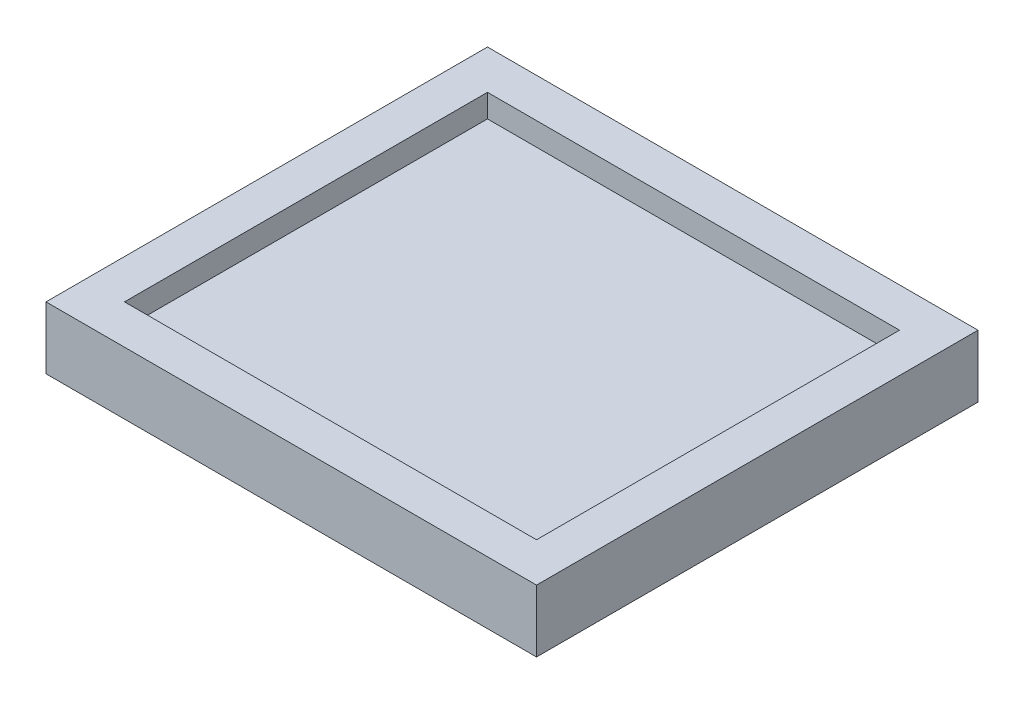
ISO-10303-21;
HEADER;
FILE_DESCRIPTION(('STEP AP214'),'2;1');
FILE_NAME('part.step','',(''),(''),'','','');
FILE_SCHEMA(('AUTOMOTIVE_DESIGN { 1 0 10303 214 1 1 1 1 }'));
ENDSEC;
DATA;
#1=APPLICATION_CONTEXT('core data for automotive mechanical design processes');
#2=APPLICATION_PROTOCOL_DEFINITION('international standard','automotive_design',2000,#1);
#3=PRODUCT_CONTEXT('',#1,'mechanical');
#4=PRODUCT('Part','Part','',(#3));
#5=PRODUCT_RELATED_PRODUCT_CATEGORY('part','',(#4));
#6=PRODUCT_DEFINITION_FORMATION('','',#4);
#7=PRODUCT_DEFINITION_CONTEXT('part definition',#1,'design');
#8=PRODUCT_DEFINITION('design','',#6,#7);
#9=PRODUCT_DEFINITION_SHAPE('','',#8);
#10=(LENGTH_UNIT() NAMED_UNIT(*) SI_UNIT(.MILLI.,.METRE.));
#11=(NAMED_UNIT(*) PLANE_ANGLE_UNIT() SI_UNIT($,.RADIAN.));
#12=(NAMED_UNIT(*) SI_UNIT($,.STERADIAN.) SOLID_ANGLE_UNIT());
#13=UNCERTAINTY_MEASURE_WITH_UNIT(LENGTH_MEASURE(1.E-05),#10,'distance_accuracy_value','');
#14=(GEOMETRIC_REPRESENTATION_CONTEXT(3) GLOBAL_UNCERTAINTY_ASSIGNED_CONTEXT((#13)) GLOBAL_UNIT_ASSIGNED_CONTEXT((#10,
#11,#12)) REPRESENTATION_CONTEXT('',''));
#15=CARTESIAN_POINT('',(0.,0.,0.));
#16=DIRECTION('',(0.,0.,1.));
#17=DIRECTION('',(1.,0.,0.));
#18=AXIS2_PLACEMENT_3D('',#15,#16,#17);
#19=CARTESIAN_POINT('',(0.,12.7,0.));
#20=DIRECTION('',(0.,-1.,0.));
#21=DIRECTION('',(0.,0.,-1.));
#22=AXIS2_PLACEMENT_3D('',#19,#20,#21);
#23=PLANE('',#22);
#24=DIRECTION('',(0.,0.,-1.));
#25=VECTOR('',#24,1.);
#26=CARTESIAN_POINT('',(50.,12.7,45.));
#27=LINE('',#26,#25);
#28=CARTESIAN_POINT('',(50.,12.7,45.));
#29=VERTEX_POINT('',#28);
#30=CARTESIAN_POINT('',(50.,12.7,-45.));
#31=VERTEX_POINT('',#30);
#32=EDGE_CURVE('E141',#29,#31,#27,.T.);
#33=ORIENTED_EDGE('',*,*,#32,.T.);
#34=DIRECTION('',(-1.,0.,0.));
#35=VECTOR('',#34,1.);
#36=CARTESIAN_POINT('',(-50.,12.7,-45.));
#37=LINE('',#36,#35);
#38=CARTESIAN_POINT('',(-50.,12.7,-45.));
#39=VERTEX_POINT('',#38);
#40=EDGE_CURVE('E85',#31,#39,#37,.T.);
#41=ORIENTED_EDGE('',*,*,#40,.T.);
#42=DIRECTION('',(0.,0.,1.));
#43=VECTOR('',#42,1.);
#44=CARTESIAN_POINT('',(-50.,12.7,45.));
#45=LINE('',#44,#43);
#46=CARTESIAN_POINT('',(-50.,12.7,45.));
#47=VERTEX_POINT('',#46);
#48=EDGE_CURVE('E144',#39,#47,#45,.T.);
#49=ORIENTED_EDGE('',*,*,#48,.T.);
#50=DIRECTION('',(1.,0.,0.));
#51=VECTOR('',#50,1.);
#52=CARTESIAN_POINT('',(-50.,12.7,45.));
#53=LINE('',#52,#51);
#54=EDGE_CURVE('E57',#47,#29,#53,.T.);
#55=ORIENTED_EDGE('',*,*,#54,.T.);
#56=EDGE_LOOP('',(#33,#41,#49,#55));
#57=FACE_BOUND('',#56,.T.);
#58=DIRECTION('',(0.,0.,-1.));
#59=VECTOR('',#58,1.);
#60=CARTESIAN_POINT('',(42.,12.7,0.));
#61=LINE('',#60,#59);
#62=CARTESIAN_POINT('',(42.,12.7,37.));
#63=VERTEX_POINT('',#62);
#64=CARTESIAN_POINT('',(42.,12.7,-37.));
#65=VERTEX_POINT('',#64);
#66=EDGE_CURVE('E130',#63,#65,#61,.T.);
#67=ORIENTED_EDGE('',*,*,#66,.F.);
#68=DIRECTION('',(1.,0.,0.));
#69=VECTOR('',#68,1.);
#70=CARTESIAN_POINT('',(0.,12.7,37.));
#71=LINE('',#70,#69);
#72=CARTESIAN_POINT('',(-42.,12.7,37.));
#73=VERTEX_POINT('',#72);
#74=EDGE_CURVE('E139',#73,#63,#71,.T.);
#75=ORIENTED_EDGE('',*,*,#74,.F.);
#76=DIRECTION('',(0.,0.,1.));
#77=VECTOR('',#76,1.);
#78=CARTESIAN_POINT('',(-42.,12.7,0.));
#79=LINE('',#78,#77);
#80=CARTESIAN_POINT('',(-42.,12.7,-37.));
#81=VERTEX_POINT('',#80);
#82=EDGE_CURVE('E137',#81,#73,#79,.T.);
#83=ORIENTED_EDGE('',*,*,#82,.F.);
#84=DIRECTION('',(-1.,0.,0.));
#85=VECTOR('',#84,1.);
#86=CARTESIAN_POINT('',(0.,12.7,-37.));
#87=LINE('',#86,#85);
#88=EDGE_CURVE('E122',#65,#81,#87,.T.);
#89=ORIENTED_EDGE('',*,*,#88,.F.);
#90=EDGE_LOOP('',(#67,#75,#83,#89));
#91=FACE_BOUND('',#90,.T.);
#92=ADVANCED_FACE('F33',(#57,#91),#23,.F.);
#93=CARTESIAN_POINT('',(50.,12.7,45.));
#94=DIRECTION('',(-1.,0.,0.));
#95=DIRECTION('',(0.,0.,1.));
#96=AXIS2_PLACEMENT_3D('',#93,#94,#95);
#97=PLANE('',#96);
#98=DIRECTION('',(0.,0.,-1.));
#99=VECTOR('',#98,1.);
#100=CARTESIAN_POINT('',(50.,0.,45.));
#101=LINE('',#100,#99);
#102=CARTESIAN_POINT('',(50.,0.,45.));
#103=VERTEX_POINT('',#102);
#104=CARTESIAN_POINT('',(50.,0.,-45.));
#105=VERTEX_POINT('',#104);
#106=EDGE_CURVE('E148',#103,#105,#101,.T.);
#107=ORIENTED_EDGE('',*,*,#106,.T.);
#108=DIRECTION('',(0.,-1.,0.));
#109=VECTOR('',#108,1.);
#110=CARTESIAN_POINT('',(50.,12.7,-45.));
#111=LINE('',#110,#109);
#112=EDGE_CURVE('E11',#31,#105,#111,.T.);
#113=ORIENTED_EDGE('',*,*,#112,.F.);
#114=ORIENTED_EDGE('',*,*,#32,.F.);
#115=DIRECTION('',(0.,-1.,0.));
#116=VECTOR('',#115,1.);
#117=CARTESIAN_POINT('',(50.,12.7,45.));
#118=LINE('',#117,#116);
#119=EDGE_CURVE('E147',#29,#103,#118,.T.);
#120=ORIENTED_EDGE('',*,*,#119,.T.);
#121=EDGE_LOOP('',(#107,#113,#114,#120));
#122=FACE_BOUND('',#121,.T.);
#123=ADVANCED_FACE('F35',(#122),#97,.F.);
#124=CARTESIAN_POINT('',(-50.,12.7,-45.));
#125=DIRECTION('',(0.,0.,1.));
#126=DIRECTION('',(1.,0.,0.));
#127=AXIS2_PLACEMENT_3D('',#124,#125,#126);
#128=PLANE('',#127);
#129=DIRECTION('',(-1.,0.,0.));
#130=VECTOR('',#129,1.);
#131=CARTESIAN_POINT('',(-50.,0.,-45.));
#132=LINE('',#131,#130);
#133=CARTESIAN_POINT('',(-50.,0.,-45.));
#134=VERTEX_POINT('',#133);
#135=EDGE_CURVE('E151',#105,#134,#132,.T.);
#136=ORIENTED_EDGE('',*,*,#135,.T.);
#137=DIRECTION('',(0.,-1.,0.));
#138=VECTOR('',#137,1.);
#139=CARTESIAN_POINT('',(-50.,12.7,-45.));
#140=LINE('',#139,#138);
#141=EDGE_CURVE('E41',#39,#134,#140,.T.);
#142=ORIENTED_EDGE('',*,*,#141,.F.);
#143=ORIENTED_EDGE('',*,*,#40,.F.);
#144=ORIENTED_EDGE('',*,*,#112,.T.);
#145=EDGE_LOOP('',(#136,#142,#143,#144));
#146=FACE_BOUND('',#145,.T.);
#147=ADVANCED_FACE('F179',(#146),#128,.F.);
#148=CARTESIAN_POINT('',(-50.,12.7,45.));
#149=DIRECTION('',(1.,0.,0.));
#150=DIRECTION('',(0.,0.,-1.));
#151=AXIS2_PLACEMENT_3D('',#148,#149,#150);
#152=PLANE('',#151);
#153=DIRECTION('',(0.,0.,1.));
#154=VECTOR('',#153,1.);
#155=CARTESIAN_POINT('',(-50.,0.,45.));
#156=LINE('',#155,#154);
#157=CARTESIAN_POINT('',(-50.,0.,45.));
#158=VERTEX_POINT('',#157);
#159=EDGE_CURVE('E153',#134,#158,#156,.T.);
#160=ORIENTED_EDGE('',*,*,#159,.T.);
#161=DIRECTION('',(0.,-1.,0.));
#162=VECTOR('',#161,1.);
#163=CARTESIAN_POINT('',(-50.,12.7,45.));
#164=LINE('',#163,#162);
#165=EDGE_CURVE('E157',#47,#158,#164,.T.);
#166=ORIENTED_EDGE('',*,*,#165,.F.);
#167=ORIENTED_EDGE('',*,*,#48,.F.);
#168=ORIENTED_EDGE('',*,*,#141,.T.);
#169=EDGE_LOOP('',(#160,#166,#167,#168));
#170=FACE_BOUND('',#169,.T.);
#171=ADVANCED_FACE('F162',(#170),#152,.F.);
#172=CARTESIAN_POINT('',(-50.,12.7,45.));
#173=DIRECTION('',(0.,0.,-1.));
#174=DIRECTION('',(-1.,0.,0.));
#175=AXIS2_PLACEMENT_3D('',#172,#173,#174);
#176=PLANE('',#175);
#177=DIRECTION('',(1.,0.,0.));
#178=VECTOR('',#177,1.);
#179=CARTESIAN_POINT('',(-50.,0.,45.));
#180=LINE('',#179,#178);
#181=EDGE_CURVE('E78',#158,#103,#180,.T.);
#182=ORIENTED_EDGE('',*,*,#181,.T.);
#183=ORIENTED_EDGE('',*,*,#119,.F.);
#184=ORIENTED_EDGE('',*,*,#54,.F.);
#185=ORIENTED_EDGE('',*,*,#165,.T.);
#186=EDGE_LOOP('',(#182,#183,#184,#185));
#187=FACE_BOUND('',#186,.T.);
#188=ADVANCED_FACE('F170',(#187),#176,.F.);
#189=CARTESIAN_POINT('',(0.,0.,0.));
#190=DIRECTION('',(0.,-1.,0.));
#191=DIRECTION('',(0.,0.,-1.));
#192=AXIS2_PLACEMENT_3D('',#189,#190,#191);
#193=PLANE('',#192);
#194=ORIENTED_EDGE('',*,*,#106,.F.);
#195=ORIENTED_EDGE('',*,*,#181,.F.);
#196=ORIENTED_EDGE('',*,*,#159,.F.);
#197=ORIENTED_EDGE('',*,*,#135,.F.);
#198=EDGE_LOOP('',(#194,#195,#196,#197));
#199=FACE_BOUND('',#198,.T.);
#200=ADVANCED_FACE('F166',(#199),#193,.T.);
#201=CARTESIAN_POINT('',(42.,12.7,45.));
#202=DIRECTION('',(-1.,0.,0.));
#203=DIRECTION('',(0.,0.,1.));
#204=AXIS2_PLACEMENT_3D('',#201,#202,#203);
#205=PLANE('',#204);
#206=DIRECTION('',(0.,0.,-1.));
#207=VECTOR('',#206,1.);
#208=CARTESIAN_POINT('',(42.,8.,0.));
#209=LINE('',#208,#207);
#210=CARTESIAN_POINT('',(42.,8.,37.));
#211=VERTEX_POINT('',#210);
#212=CARTESIAN_POINT('',(42.,8.,-37.));
#213=VERTEX_POINT('',#212);
#214=EDGE_CURVE('E113',#211,#213,#209,.T.);
#215=ORIENTED_EDGE('',*,*,#214,.F.);
#216=DIRECTION('',(0.,-1.,0.));
#217=VECTOR('',#216,1.);
#218=CARTESIAN_POINT('',(42.,12.7,37.));
#219=LINE('',#218,#217);
#220=EDGE_CURVE('E133',#63,#211,#219,.T.);
#221=ORIENTED_EDGE('',*,*,#220,.F.);
#222=ORIENTED_EDGE('',*,*,#66,.T.);
#223=DIRECTION('',(0.,-1.,0.));
#224=VECTOR('',#223,1.);
#225=CARTESIAN_POINT('',(42.,12.7,-37.));
#226=LINE('',#225,#224);
#227=EDGE_CURVE('E125',#65,#213,#226,.T.);
#228=ORIENTED_EDGE('',*,*,#227,.T.);
#229=EDGE_LOOP('',(#215,#221,#222,#228));
#230=FACE_BOUND('',#229,.T.);
#231=ADVANCED_FACE('F177',(#230),#205,.T.);
#232=CARTESIAN_POINT('',(-50.,12.7,-37.));
#233=DIRECTION('',(0.,0.,1.));
#234=DIRECTION('',(1.,0.,0.));
#235=AXIS2_PLACEMENT_3D('',#232,#233,#234);
#236=PLANE('',#235);
#237=DIRECTION('',(-1.,0.,0.));
#238=VECTOR('',#237,1.);
#239=CARTESIAN_POINT('',(0.,8.,-37.));
#240=LINE('',#239,#238);
#241=CARTESIAN_POINT('',(-42.,8.,-37.));
#242=VERTEX_POINT('',#241);
#243=EDGE_CURVE('E107',#213,#242,#240,.T.);
#244=ORIENTED_EDGE('',*,*,#243,.F.);
#245=ORIENTED_EDGE('',*,*,#227,.F.);
#246=ORIENTED_EDGE('',*,*,#88,.T.);
#247=DIRECTION('',(0.,-1.,0.));
#248=VECTOR('',#247,1.);
#249=CARTESIAN_POINT('',(-42.,12.7,-37.));
#250=LINE('',#249,#248);
#251=EDGE_CURVE('E119',#81,#242,#250,.T.);
#252=ORIENTED_EDGE('',*,*,#251,.T.);
#253=EDGE_LOOP('',(#244,#245,#246,#252));
#254=FACE_BOUND('',#253,.T.);
#255=ADVANCED_FACE('F120',(#254),#236,.T.);
#256=CARTESIAN_POINT('',(-42.,12.7,45.));
#257=DIRECTION('',(1.,0.,0.));
#258=DIRECTION('',(0.,0.,-1.));
#259=AXIS2_PLACEMENT_3D('',#256,#257,#258);
#260=PLANE('',#259);
#261=DIRECTION('',(0.,0.,1.));
#262=VECTOR('',#261,1.);
#263=CARTESIAN_POINT('',(-42.,8.,0.));
#264=LINE('',#263,#262);
#265=CARTESIAN_POINT('',(-42.,8.,37.));
#266=VERTEX_POINT('',#265);
#267=EDGE_CURVE('E111',#242,#266,#264,.T.);
#268=ORIENTED_EDGE('',*,*,#267,.F.);
#269=ORIENTED_EDGE('',*,*,#251,.F.);
#270=ORIENTED_EDGE('',*,*,#82,.T.);
#271=DIRECTION('',(0.,-1.,0.));
#272=VECTOR('',#271,1.);
#273=CARTESIAN_POINT('',(-42.,12.7,37.));
#274=LINE('',#273,#272);
#275=EDGE_CURVE('E48',#73,#266,#274,.T.);
#276=ORIENTED_EDGE('',*,*,#275,.T.);
#277=EDGE_LOOP('',(#268,#269,#270,#276));
#278=FACE_BOUND('',#277,.T.);
#279=ADVANCED_FACE('F127',(#278),#260,.T.);
#280=CARTESIAN_POINT('',(-50.,12.7,37.));
#281=DIRECTION('',(0.,0.,-1.));
#282=DIRECTION('',(-1.,0.,0.));
#283=AXIS2_PLACEMENT_3D('',#280,#281,#282);
#284=PLANE('',#283);
#285=DIRECTION('',(1.,0.,0.));
#286=VECTOR('',#285,1.);
#287=CARTESIAN_POINT('',(0.,8.,37.));
#288=LINE('',#287,#286);
#289=EDGE_CURVE('E128',#266,#211,#288,.T.);
#290=ORIENTED_EDGE('',*,*,#289,.F.);
#291=ORIENTED_EDGE('',*,*,#275,.F.);
#292=ORIENTED_EDGE('',*,*,#74,.T.);
#293=ORIENTED_EDGE('',*,*,#220,.T.);
#294=EDGE_LOOP('',(#290,#291,#292,#293));
#295=FACE_BOUND('',#294,.T.);
#296=ADVANCED_FACE('F190',(#295),#284,.T.);
#297=CARTESIAN_POINT('',(0.,8.,0.));
#298=DIRECTION('',(0.,-1.,0.));
#299=DIRECTION('',(0.,0.,-1.));
#300=AXIS2_PLACEMENT_3D('',#297,#298,#299);
#301=PLANE('',#300);
#302=ORIENTED_EDGE('',*,*,#214,.T.);
#303=ORIENTED_EDGE('',*,*,#243,.T.);
#304=ORIENTED_EDGE('',*,*,#267,.T.);
#305=ORIENTED_EDGE('',*,*,#289,.T.);
#306=EDGE_LOOP('',(#302,#303,#304,#305));
#307=FACE_BOUND('',#306,.T.);
#308=ADVANCED_FACE('F109',(#307),#301,.F.);
#309=CLOSED_SHELL('',(#92,#123,#147,#171,#188,#200,#231,#255,#279,#296,#308));
#310=MANIFOLD_SOLID_BREP('B2',#309);
#311=ADVANCED_BREP_SHAPE_REPRESENTATION('',(#18,#310),#14);
#312=SHAPE_DEFINITION_REPRESENTATION(#9,#311);
ENDSEC;
END-ISO-10303-21;
